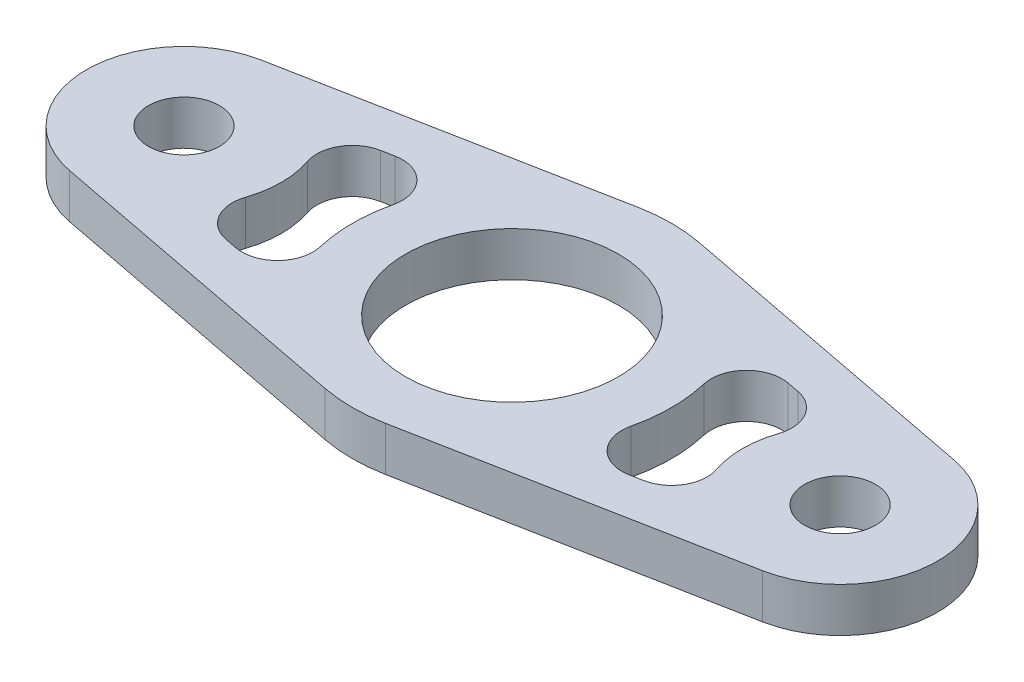
ISO-10303-21;
HEADER;
FILE_DESCRIPTION(('STEP AP214'),'2;1');
FILE_NAME('part.step','',(''),(''),'','','');
FILE_SCHEMA(('AUTOMOTIVE_DESIGN { 1 0 10303 214 1 1 1 1 }'));
ENDSEC;
DATA;
#1=APPLICATION_CONTEXT('core data for automotive mechanical design processes');
#2=APPLICATION_PROTOCOL_DEFINITION('international standard','automotive_design',2000,#1);
#3=PRODUCT_CONTEXT('',#1,'mechanical');
#4=PRODUCT('Part','Part','',(#3));
#5=PRODUCT_RELATED_PRODUCT_CATEGORY('part','',(#4));
#6=PRODUCT_DEFINITION_FORMATION('','',#4);
#7=PRODUCT_DEFINITION_CONTEXT('part definition',#1,'design');
#8=PRODUCT_DEFINITION('design','',#6,#7);
#9=PRODUCT_DEFINITION_SHAPE('','',#8);
#10=(LENGTH_UNIT() NAMED_UNIT(*) SI_UNIT(.MILLI.,.METRE.));
#11=(NAMED_UNIT(*) PLANE_ANGLE_UNIT() SI_UNIT($,.RADIAN.));
#12=(NAMED_UNIT(*) SI_UNIT($,.STERADIAN.) SOLID_ANGLE_UNIT());
#13=UNCERTAINTY_MEASURE_WITH_UNIT(LENGTH_MEASURE(1.E-05),#10,'distance_accuracy_value','');
#14=(GEOMETRIC_REPRESENTATION_CONTEXT(3) GLOBAL_UNCERTAINTY_ASSIGNED_CONTEXT((#13)) GLOBAL_UNIT_ASSIGNED_CONTEXT((#10,
#11,#12)) REPRESENTATION_CONTEXT('',''));
#15=CARTESIAN_POINT('',(0.,0.,0.));
#16=DIRECTION('',(0.,0.,1.));
#17=DIRECTION('',(1.,0.,0.));
#18=AXIS2_PLACEMENT_3D('',#15,#16,#17);
#19=CARTESIAN_POINT('',(3.4054054054054,2.5,-17.6749317968935));
#20=DIRECTION('',(-0.189189189189189,0.,0.98194065538297));
#21=DIRECTION('',(0.98194065538297,0.,0.189189189189189));
#22=AXIS2_PLACEMENT_3D('',#19,#20,#21);
#23=PLANE('',#22);
#24=DIRECTION('',(-0.98194065538297,0.,-0.189189189189189));
#25=VECTOR('',#24,1.);
#26=CARTESIAN_POINT('',(3.4054054054054,-2.5,-17.6749317968935));
#27=LINE('',#26,#25);
#28=CARTESIAN_POINT('',(39.0810810810811,-2.5,-10.8013472092127));
#29=VERTEX_POINT('',#28);
#30=CARTESIAN_POINT('',(3.40540540540541,-2.5,-17.6749317968935));
#31=VERTEX_POINT('',#30);
#32=EDGE_CURVE('E234',#29,#31,#27,.T.);
#33=ORIENTED_EDGE('',*,*,#32,.T.);
#34=DIRECTION('',(0.,-1.,0.));
#35=VECTOR('',#34,1.);
#36=CARTESIAN_POINT('',(3.40540540540541,2.5,-17.6749317968935));
#37=LINE('',#36,#35);
#38=CARTESIAN_POINT('',(3.40540540540541,2.5,-17.6749317968935));
#39=VERTEX_POINT('',#38);
#40=EDGE_CURVE('E213',#39,#31,#37,.T.);
#41=ORIENTED_EDGE('',*,*,#40,.F.);
#42=DIRECTION('',(-0.98194065538297,0.,-0.189189189189189));
#43=VECTOR('',#42,1.);
#44=CARTESIAN_POINT('',(3.4054054054054,2.5,-17.6749317968935));
#45=LINE('',#44,#43);
#46=CARTESIAN_POINT('',(39.0810810810811,2.5,-10.8013472092127));
#47=VERTEX_POINT('',#46);
#48=EDGE_CURVE('E221',#47,#39,#45,.T.);
#49=ORIENTED_EDGE('',*,*,#48,.F.);
#50=DIRECTION('',(0.,-1.,0.));
#51=VECTOR('',#50,1.);
#52=CARTESIAN_POINT('',(39.0810810810811,2.5,-10.8013472092127));
#53=LINE('',#52,#51);
#54=EDGE_CURVE('E404',#47,#29,#53,.T.);
#55=ORIENTED_EDGE('',*,*,#54,.T.);
#56=EDGE_LOOP('',(#33,#41,#49,#55));
#57=FACE_BOUND('',#56,.T.);
#58=ADVANCED_FACE('F45',(#57),#23,.F.);
#59=CARTESIAN_POINT('',(0.,2.5,0.));
#60=DIRECTION('',(0.,-1.,0.));
#61=DIRECTION('',(0.,0.,-1.));
#62=AXIS2_PLACEMENT_3D('',#59,#60,#61);
#63=CYLINDRICAL_SURFACE('',#62,18.);
#64=CARTESIAN_POINT('',(0.,-2.5,0.));
#65=DIRECTION('',(0.,1.,0.));
#66=DIRECTION('',(0.,0.,1.));
#67=AXIS2_PLACEMENT_3D('',#64,#65,#66);
#68=CIRCLE('',#67,18.);
#69=CARTESIAN_POINT('',(-3.40540540540541,-2.5,-17.6749317968935));
#70=VERTEX_POINT('',#69);
#71=EDGE_CURVE('E444',#31,#70,#68,.T.);
#72=ORIENTED_EDGE('',*,*,#71,.T.);
#73=DIRECTION('',(0.,-1.,0.));
#74=VECTOR('',#73,1.);
#75=CARTESIAN_POINT('',(-3.40540540540541,2.5,-17.6749317968935));
#76=LINE('',#75,#74);
#77=CARTESIAN_POINT('',(-3.40540540540541,2.5,-17.6749317968935));
#78=VERTEX_POINT('',#77);
#79=EDGE_CURVE('E215',#78,#70,#76,.T.);
#80=ORIENTED_EDGE('',*,*,#79,.F.);
#81=CARTESIAN_POINT('',(0.,2.5,0.));
#82=DIRECTION('',(0.,1.,0.));
#83=DIRECTION('',(0.,0.,1.));
#84=AXIS2_PLACEMENT_3D('',#81,#82,#83);
#85=CIRCLE('',#84,18.);
#86=EDGE_CURVE('E208',#39,#78,#85,.T.);
#87=ORIENTED_EDGE('',*,*,#86,.F.);
#88=ORIENTED_EDGE('',*,*,#40,.T.);
#89=EDGE_LOOP('',(#72,#80,#87,#88));
#90=FACE_BOUND('',#89,.T.);
#91=ADVANCED_FACE('F211',(#90),#63,.T.);
#92=CARTESIAN_POINT('',(-3.4054054054054,2.5,-17.6749317968935));
#93=DIRECTION('',(-0.189189189189189,0.,-0.98194065538297));
#94=DIRECTION('',(-0.98194065538297,0.,0.189189189189189));
#95=AXIS2_PLACEMENT_3D('',#92,#93,#94);
#96=PLANE('',#95);
#97=DIRECTION('',(0.98194065538297,0.,-0.189189189189189));
#98=VECTOR('',#97,1.);
#99=CARTESIAN_POINT('',(-3.4054054054054,-2.5,-17.6749317968935));
#100=LINE('',#99,#98);
#101=CARTESIAN_POINT('',(-39.0810810810811,-2.5,-10.8013472092127));
#102=VERTEX_POINT('',#101);
#103=EDGE_CURVE('E447',#102,#70,#100,.T.);
#104=ORIENTED_EDGE('',*,*,#103,.F.);
#105=DIRECTION('',(0.,-1.,0.));
#106=VECTOR('',#105,1.);
#107=CARTESIAN_POINT('',(-39.0810810810811,2.5,-10.8013472092127));
#108=LINE('',#107,#106);
#109=CARTESIAN_POINT('',(-39.0810810810811,2.5,-10.8013472092127));
#110=VERTEX_POINT('',#109);
#111=EDGE_CURVE('E242',#110,#102,#108,.T.);
#112=ORIENTED_EDGE('',*,*,#111,.F.);
#113=DIRECTION('',(0.98194065538297,0.,-0.189189189189189));
#114=VECTOR('',#113,1.);
#115=CARTESIAN_POINT('',(-3.4054054054054,2.5,-17.6749317968935));
#116=LINE('',#115,#114);
#117=EDGE_CURVE('E220',#110,#78,#116,.T.);
#118=ORIENTED_EDGE('',*,*,#117,.T.);
#119=ORIENTED_EDGE('',*,*,#79,.T.);
#120=EDGE_LOOP('',(#104,#112,#118,#119));
#121=FACE_BOUND('',#120,.T.);
#122=ADVANCED_FACE('F496',(#121),#96,.T.);
#123=CARTESIAN_POINT('',(-37.,2.5,0.));
#124=DIRECTION('',(0.,-1.,0.));
#125=DIRECTION('',(0.,0.,-1.));
#126=AXIS2_PLACEMENT_3D('',#123,#124,#125);
#127=CYLINDRICAL_SURFACE('',#126,11.);
#128=CARTESIAN_POINT('',(-37.,-2.5,0.));
#129=DIRECTION('',(0.,1.,0.));
#130=DIRECTION('',(0.,0.,1.));
#131=AXIS2_PLACEMENT_3D('',#128,#129,#130);
#132=CIRCLE('',#131,11.);
#133=CARTESIAN_POINT('',(-39.0810810810811,-2.5,10.8013472092127));
#134=VERTEX_POINT('',#133);
#135=EDGE_CURVE('E451',#102,#134,#132,.T.);
#136=ORIENTED_EDGE('',*,*,#135,.T.);
#137=DIRECTION('',(0.,-1.,0.));
#138=VECTOR('',#137,1.);
#139=CARTESIAN_POINT('',(-39.0810810810811,2.5,10.8013472092127));
#140=LINE('',#139,#138);
#141=CARTESIAN_POINT('',(-39.0810810810811,2.5,10.8013472092127));
#142=VERTEX_POINT('',#141);
#143=EDGE_CURVE('E482',#142,#134,#140,.T.);
#144=ORIENTED_EDGE('',*,*,#143,.F.);
#145=CARTESIAN_POINT('',(-37.,2.5,0.));
#146=DIRECTION('',(0.,1.,0.));
#147=DIRECTION('',(0.,0.,1.));
#148=AXIS2_PLACEMENT_3D('',#145,#146,#147);
#149=CIRCLE('',#148,11.);
#150=EDGE_CURVE('E389',#110,#142,#149,.T.);
#151=ORIENTED_EDGE('',*,*,#150,.F.);
#152=ORIENTED_EDGE('',*,*,#111,.T.);
#153=EDGE_LOOP('',(#136,#144,#151,#152));
#154=FACE_BOUND('',#153,.T.);
#155=ADVANCED_FACE('F489',(#154),#127,.T.);
#156=CARTESIAN_POINT('',(-3.4054054054054,2.5,17.6749317968935));
#157=DIRECTION('',(0.189189189189189,0.,-0.98194065538297));
#158=DIRECTION('',(-0.98194065538297,0.,-0.189189189189189));
#159=AXIS2_PLACEMENT_3D('',#156,#157,#158);
#160=PLANE('',#159);
#161=DIRECTION('',(0.98194065538297,0.,0.189189189189189));
#162=VECTOR('',#161,1.);
#163=CARTESIAN_POINT('',(-3.4054054054054,-2.5,17.6749317968935));
#164=LINE('',#163,#162);
#165=CARTESIAN_POINT('',(-3.40540540540541,-2.5,17.6749317968935));
#166=VERTEX_POINT('',#165);
#167=EDGE_CURVE('E454',#134,#166,#164,.T.);
#168=ORIENTED_EDGE('',*,*,#167,.T.);
#169=DIRECTION('',(0.,-1.,0.));
#170=VECTOR('',#169,1.);
#171=CARTESIAN_POINT('',(-3.40540540540541,2.5,17.6749317968935));
#172=LINE('',#171,#170);
#173=CARTESIAN_POINT('',(-3.40540540540541,2.5,17.6749317968935));
#174=VERTEX_POINT('',#173);
#175=EDGE_CURVE('E478',#174,#166,#172,.T.);
#176=ORIENTED_EDGE('',*,*,#175,.F.);
#177=DIRECTION('',(0.98194065538297,0.,0.189189189189189));
#178=VECTOR('',#177,1.);
#179=CARTESIAN_POINT('',(-3.4054054054054,2.5,17.6749317968935));
#180=LINE('',#179,#178);
#181=EDGE_CURVE('E392',#142,#174,#180,.T.);
#182=ORIENTED_EDGE('',*,*,#181,.F.);
#183=ORIENTED_EDGE('',*,*,#143,.T.);
#184=EDGE_LOOP('',(#168,#176,#182,#183));
#185=FACE_BOUND('',#184,.T.);
#186=ADVANCED_FACE('F510',(#185),#160,.F.);
#187=CARTESIAN_POINT('',(0.,2.5,0.));
#188=DIRECTION('',(0.,-1.,0.));
#189=DIRECTION('',(0.,0.,-1.));
#190=AXIS2_PLACEMENT_3D('',#187,#188,#189);
#191=CYLINDRICAL_SURFACE('',#190,18.);
#192=CARTESIAN_POINT('',(0.,-2.5,0.));
#193=DIRECTION('',(0.,1.,0.));
#194=DIRECTION('',(0.,0.,1.));
#195=AXIS2_PLACEMENT_3D('',#192,#193,#194);
#196=CIRCLE('',#195,18.);
#197=CARTESIAN_POINT('',(3.40540540540541,-2.5,17.6749317968935));
#198=VERTEX_POINT('',#197);
#199=EDGE_CURVE('E457',#166,#198,#196,.T.);
#200=ORIENTED_EDGE('',*,*,#199,.T.);
#201=DIRECTION('',(0.,-1.,0.));
#202=VECTOR('',#201,1.);
#203=CARTESIAN_POINT('',(3.40540540540541,2.5,17.6749317968935));
#204=LINE('',#203,#202);
#205=CARTESIAN_POINT('',(3.40540540540541,2.5,17.6749317968935));
#206=VERTEX_POINT('',#205);
#207=EDGE_CURVE('E475',#206,#198,#204,.T.);
#208=ORIENTED_EDGE('',*,*,#207,.F.);
#209=CARTESIAN_POINT('',(0.,2.5,0.));
#210=DIRECTION('',(0.,1.,0.));
#211=DIRECTION('',(0.,0.,1.));
#212=AXIS2_PLACEMENT_3D('',#209,#210,#211);
#213=CIRCLE('',#212,18.);
#214=EDGE_CURVE('E395',#174,#206,#213,.T.);
#215=ORIENTED_EDGE('',*,*,#214,.F.);
#216=ORIENTED_EDGE('',*,*,#175,.T.);
#217=EDGE_LOOP('',(#200,#208,#215,#216));
#218=FACE_BOUND('',#217,.T.);
#219=ADVANCED_FACE('F505',(#218),#191,.T.);
#220=CARTESIAN_POINT('',(3.4054054054054,2.5,17.6749317968935));
#221=DIRECTION('',(0.189189189189189,0.,0.98194065538297));
#222=DIRECTION('',(0.98194065538297,0.,-0.189189189189189));
#223=AXIS2_PLACEMENT_3D('',#220,#221,#222);
#224=PLANE('',#223);
#225=DIRECTION('',(-0.98194065538297,0.,0.189189189189189));
#226=VECTOR('',#225,1.);
#227=CARTESIAN_POINT('',(3.4054054054054,-2.5,17.6749317968935));
#228=LINE('',#227,#226);
#229=CARTESIAN_POINT('',(39.0810810810811,-2.5,10.8013472092127));
#230=VERTEX_POINT('',#229);
#231=EDGE_CURVE('E461',#230,#198,#228,.T.);
#232=ORIENTED_EDGE('',*,*,#231,.F.);
#233=DIRECTION('',(0.,-1.,0.));
#234=VECTOR('',#233,1.);
#235=CARTESIAN_POINT('',(39.0810810810811,2.5,10.8013472092127));
#236=LINE('',#235,#234);
#237=CARTESIAN_POINT('',(39.0810810810811,2.5,10.8013472092127));
#238=VERTEX_POINT('',#237);
#239=EDGE_CURVE('E472',#238,#230,#236,.T.);
#240=ORIENTED_EDGE('',*,*,#239,.F.);
#241=DIRECTION('',(-0.98194065538297,0.,0.189189189189189));
#242=VECTOR('',#241,1.);
#243=CARTESIAN_POINT('',(3.4054054054054,2.5,17.6749317968935));
#244=LINE('',#243,#242);
#245=EDGE_CURVE('E398',#238,#206,#244,.T.);
#246=ORIENTED_EDGE('',*,*,#245,.T.);
#247=ORIENTED_EDGE('',*,*,#207,.T.);
#248=EDGE_LOOP('',(#232,#240,#246,#247));
#249=FACE_BOUND('',#248,.T.);
#250=ADVANCED_FACE('F502',(#249),#224,.T.);
#251=CARTESIAN_POINT('',(37.,2.5,0.));
#252=DIRECTION('',(0.,-1.,0.));
#253=DIRECTION('',(0.,0.,-1.));
#254=AXIS2_PLACEMENT_3D('',#251,#252,#253);
#255=CYLINDRICAL_SURFACE('',#254,11.);
#256=CARTESIAN_POINT('',(37.,-2.5,0.));
#257=DIRECTION('',(0.,1.,0.));
#258=DIRECTION('',(0.,0.,1.));
#259=AXIS2_PLACEMENT_3D('',#256,#257,#258);
#260=CIRCLE('',#259,11.);
#261=CARTESIAN_POINT('',(26.57257279909,-2.5,3.50267925590137));
#262=VERTEX_POINT('',#261);
#263=CARTESIAN_POINT('',(26.57257279909,-2.5,-3.50267925590137));
#264=VERTEX_POINT('',#263);
#265=EDGE_CURVE('E426',#262,#264,#260,.F.);
#266=ORIENTED_EDGE('',*,*,#265,.F.);
#267=DIRECTION('',(0.,-1.,0.));
#268=VECTOR('',#267,1.);
#269=CARTESIAN_POINT('',(26.57257279909,2.5,3.50267925590137));
#270=LINE('',#269,#268);
#271=CARTESIAN_POINT('',(26.57257279909,2.5,3.50267925590137));
#272=VERTEX_POINT('',#271);
#273=EDGE_CURVE('E253',#262,#272,#270,.F.);
#274=ORIENTED_EDGE('',*,*,#273,.T.);
#275=CARTESIAN_POINT('',(37.,2.5,0.));
#276=DIRECTION('',(0.,1.,0.));
#277=DIRECTION('',(0.,0.,1.));
#278=AXIS2_PLACEMENT_3D('',#275,#276,#277);
#279=CIRCLE('',#278,11.);
#280=CARTESIAN_POINT('',(26.57257279909,2.5,-3.50267925590137));
#281=VERTEX_POINT('',#280);
#282=EDGE_CURVE('E366',#272,#281,#279,.F.);
#283=ORIENTED_EDGE('',*,*,#282,.T.);
#284=DIRECTION('',(0.,-1.,0.));
#285=VECTOR('',#284,1.);
#286=CARTESIAN_POINT('',(26.57257279909,2.5,-3.50267925590137));
#287=LINE('',#286,#285);
#288=EDGE_CURVE('E249',#281,#264,#287,.T.);
#289=ORIENTED_EDGE('',*,*,#288,.T.);
#290=EDGE_LOOP('',(#266,#274,#283,#289));
#291=FACE_BOUND('',#290,.T.);
#292=ADVANCED_FACE('F539',(#291),#255,.T.);
#293=CARTESIAN_POINT('',(2.45945945945946,2.5,12.7652285199786));
#294=DIRECTION('',(0.189189189189189,0.,0.98194065538297));
#295=DIRECTION('',(0.98194065538297,0.,-0.189189189189189));
#296=AXIS2_PLACEMENT_3D('',#293,#294,#295);
#297=PLANE('',#296);
#298=DIRECTION('',(-0.98194065538297,0.,0.189189189189189));
#299=VECTOR('',#298,1.);
#300=CARTESIAN_POINT('',(2.45945945945946,2.5,12.7652285199786));
#301=LINE('',#300,#299);
#302=CARTESIAN_POINT('',(23.5375378464249,2.5,8.70414342503375));
#303=VERTEX_POINT('',#302);
#304=CARTESIAN_POINT('',(22.1717805462736,2.5,8.96728205243285));
#305=VERTEX_POINT('',#304);
#306=EDGE_CURVE('E371',#303,#305,#301,.T.);
#307=ORIENTED_EDGE('',*,*,#306,.F.);
#308=DIRECTION('',(0.,-1.,0.));
#309=VECTOR('',#308,1.);
#310=CARTESIAN_POINT('',(23.5375378464249,2.5,8.70414342503375));
#311=LINE('',#310,#309);
#312=CARTESIAN_POINT('',(23.5375378464249,-2.5,8.70414342503375));
#313=VERTEX_POINT('',#312);
#314=EDGE_CURVE('E240',#303,#313,#311,.T.);
#315=ORIENTED_EDGE('',*,*,#314,.T.);
#316=DIRECTION('',(-0.98194065538297,0.,0.189189189189189));
#317=VECTOR('',#316,1.);
#318=CARTESIAN_POINT('',(2.45945945945946,-2.5,12.7652285199786));
#319=LINE('',#318,#317);
#320=CARTESIAN_POINT('',(22.1717805462736,-2.5,8.96728205243285));
#321=VERTEX_POINT('',#320);
#322=EDGE_CURVE('E430',#313,#321,#319,.T.);
#323=ORIENTED_EDGE('',*,*,#322,.T.);
#324=DIRECTION('',(0.,-1.,0.));
#325=VECTOR('',#324,1.);
#326=CARTESIAN_POINT('',(22.1717805462736,2.5,8.96728205243285));
#327=LINE('',#326,#325);
#328=EDGE_CURVE('E236',#321,#305,#327,.F.);
#329=ORIENTED_EDGE('',*,*,#328,.T.);
#330=EDGE_LOOP('',(#307,#315,#323,#329));
#331=FACE_BOUND('',#330,.T.);
#332=ADVANCED_FACE('F535',(#331),#297,.F.);
#333=CARTESIAN_POINT('',(0.,2.5,0.));
#334=DIRECTION('',(0.,-1.,0.));
#335=DIRECTION('',(0.,0.,-1.));
#336=AXIS2_PLACEMENT_3D('',#333,#334,#335);
#337=CYLINDRICAL_SURFACE('',#336,18.);
#338=CARTESIAN_POINT('',(0.,2.5,0.));
#339=DIRECTION('',(0.,1.,0.));
#340=DIRECTION('',(0.,0.,1.));
#341=AXIS2_PLACEMENT_3D('',#338,#339,#340);
#342=CIRCLE('',#341,18.);
#343=CARTESIAN_POINT('',(17.5213831005138,2.5,-4.12324317073716));
#344=VERTEX_POINT('',#343);
#345=CARTESIAN_POINT('',(17.5213831005138,2.5,4.12324317073716));
#346=VERTEX_POINT('',#345);
#347=EDGE_CURVE('E380',#344,#346,#342,.F.);
#348=ORIENTED_EDGE('',*,*,#347,.T.);
#349=DIRECTION('',(0.,-1.,0.));
#350=VECTOR('',#349,1.);
#351=CARTESIAN_POINT('',(17.5213831005138,2.5,4.12324317073716));
#352=LINE('',#351,#350);
#353=CARTESIAN_POINT('',(17.5213831005138,-2.5,4.12324317073716));
#354=VERTEX_POINT('',#353);
#355=EDGE_CURVE('E259',#346,#354,#352,.T.);
#356=ORIENTED_EDGE('',*,*,#355,.T.);
#357=CARTESIAN_POINT('',(0.,-2.5,0.));
#358=DIRECTION('',(0.,1.,0.));
#359=DIRECTION('',(0.,0.,1.));
#360=AXIS2_PLACEMENT_3D('',#357,#358,#359);
#361=CIRCLE('',#360,18.);
#362=CARTESIAN_POINT('',(17.5213831005138,-2.5,-4.12324317073716));
#363=VERTEX_POINT('',#362);
#364=EDGE_CURVE('E434',#363,#354,#361,.F.);
#365=ORIENTED_EDGE('',*,*,#364,.F.);
#366=DIRECTION('',(0.,-1.,0.));
#367=VECTOR('',#366,1.);
#368=CARTESIAN_POINT('',(17.5213831005138,2.5,-4.12324317073716));
#369=LINE('',#368,#367);
#370=EDGE_CURVE('E256',#363,#344,#369,.F.);
#371=ORIENTED_EDGE('',*,*,#370,.T.);
#372=EDGE_LOOP('',(#348,#356,#365,#371));
#373=FACE_BOUND('',#372,.T.);
#374=ADVANCED_FACE('F531',(#373),#337,.T.);
#375=CARTESIAN_POINT('',(-2.45945945945946,2.5,12.7652285199786));
#376=DIRECTION('',(0.189189189189189,0.,-0.98194065538297));
#377=DIRECTION('',(-0.98194065538297,0.,-0.189189189189189));
#378=AXIS2_PLACEMENT_3D('',#375,#376,#377);
#379=PLANE('',#378);
#380=DIRECTION('',(0.98194065538297,0.,0.189189189189189));
#381=VECTOR('',#380,1.);
#382=CARTESIAN_POINT('',(-2.45945945945946,2.5,12.7652285199786));
#383=LINE('',#382,#381);
#384=CARTESIAN_POINT('',(-23.5375378464249,2.5,8.70414342503375));
#385=VERTEX_POINT('',#384);
#386=CARTESIAN_POINT('',(-22.1717805462736,2.5,8.96728205243285));
#387=VERTEX_POINT('',#386);
#388=EDGE_CURVE('E604',#385,#387,#383,.T.);
#389=ORIENTED_EDGE('',*,*,#388,.T.);
#390=DIRECTION('',(0.,-1.,0.));
#391=VECTOR('',#390,1.);
#392=CARTESIAN_POINT('',(-22.1717805462736,2.5,8.96728205243285));
#393=LINE('',#392,#391);
#394=CARTESIAN_POINT('',(-22.1717805462736,-2.5,8.96728205243285));
#395=VERTEX_POINT('',#394);
#396=EDGE_CURVE('E273',#387,#395,#393,.T.);
#397=ORIENTED_EDGE('',*,*,#396,.T.);
#398=DIRECTION('',(0.98194065538297,0.,0.189189189189189));
#399=VECTOR('',#398,1.);
#400=CARTESIAN_POINT('',(-2.45945945945946,-2.5,12.7652285199786));
#401=LINE('',#400,#399);
#402=CARTESIAN_POINT('',(-23.5375378464249,-2.5,8.70414342503375));
#403=VERTEX_POINT('',#402);
#404=EDGE_CURVE('E417',#403,#395,#401,.T.);
#405=ORIENTED_EDGE('',*,*,#404,.F.);
#406=DIRECTION('',(0.,-1.,0.));
#407=VECTOR('',#406,1.);
#408=CARTESIAN_POINT('',(-23.5375378464249,2.5,8.70414342503375));
#409=LINE('',#408,#407);
#410=EDGE_CURVE('E270',#403,#385,#409,.F.);
#411=ORIENTED_EDGE('',*,*,#410,.T.);
#412=EDGE_LOOP('',(#389,#397,#405,#411));
#413=FACE_BOUND('',#412,.T.);
#414=ADVANCED_FACE('F534',(#413),#379,.T.);
#415=CARTESIAN_POINT('',(-37.,2.5,0.));
#416=DIRECTION('',(0.,-1.,0.));
#417=DIRECTION('',(0.,0.,-1.));
#418=AXIS2_PLACEMENT_3D('',#415,#416,#417);
#419=CYLINDRICAL_SURFACE('',#418,11.);
#420=CARTESIAN_POINT('',(-37.,2.5,0.));
#421=DIRECTION('',(0.,1.,0.));
#422=DIRECTION('',(0.,0.,1.));
#423=AXIS2_PLACEMENT_3D('',#420,#421,#422);
#424=CIRCLE('',#423,11.);
#425=CARTESIAN_POINT('',(-26.57257279909,2.5,3.50267925590137));
#426=VERTEX_POINT('',#425);
#427=CARTESIAN_POINT('',(-26.57257279909,2.5,-3.50267925590137));
#428=VERTEX_POINT('',#427);
#429=EDGE_CURVE('E373',#426,#428,#424,.T.);
#430=ORIENTED_EDGE('',*,*,#429,.F.);
#431=DIRECTION('',(0.,-1.,0.));
#432=VECTOR('',#431,1.);
#433=CARTESIAN_POINT('',(-26.57257279909,2.5,3.50267925590137));
#434=LINE('',#433,#432);
#435=CARTESIAN_POINT('',(-26.57257279909,-2.5,3.50267925590137));
#436=VERTEX_POINT('',#435);
#437=EDGE_CURVE('E287',#426,#436,#434,.T.);
#438=ORIENTED_EDGE('',*,*,#437,.T.);
#439=CARTESIAN_POINT('',(-37.,-2.5,0.));
#440=DIRECTION('',(0.,1.,0.));
#441=DIRECTION('',(0.,0.,1.));
#442=AXIS2_PLACEMENT_3D('',#439,#440,#441);
#443=CIRCLE('',#442,11.);
#444=CARTESIAN_POINT('',(-26.57257279909,-2.5,-3.50267925590137));
#445=VERTEX_POINT('',#444);
#446=EDGE_CURVE('E352',#436,#445,#443,.T.);
#447=ORIENTED_EDGE('',*,*,#446,.T.);
#448=DIRECTION('',(0.,-1.,0.));
#449=VECTOR('',#448,1.);
#450=CARTESIAN_POINT('',(-26.57257279909,2.5,-3.50267925590137));
#451=LINE('',#450,#449);
#452=EDGE_CURVE('E284',#445,#428,#451,.F.);
#453=ORIENTED_EDGE('',*,*,#452,.T.);
#454=EDGE_LOOP('',(#430,#438,#447,#453));
#455=FACE_BOUND('',#454,.T.);
#456=ADVANCED_FACE('F549',(#455),#419,.T.);
#457=CARTESIAN_POINT('',(-2.45945945945946,2.5,-12.7652285199786));
#458=DIRECTION('',(-0.189189189189189,0.,-0.98194065538297));
#459=DIRECTION('',(-0.98194065538297,0.,0.189189189189189));
#460=AXIS2_PLACEMENT_3D('',#457,#458,#459);
#461=PLANE('',#460);
#462=DIRECTION('',(0.98194065538297,0.,-0.189189189189189));
#463=VECTOR('',#462,1.);
#464=CARTESIAN_POINT('',(-2.45945945945946,2.5,-12.7652285199786));
#465=LINE('',#464,#463);
#466=CARTESIAN_POINT('',(-23.5375378464249,2.5,-8.70414342503375));
#467=VERTEX_POINT('',#466);
#468=CARTESIAN_POINT('',(-22.1717805462736,2.5,-8.96728205243285));
#469=VERTEX_POINT('',#468);
#470=EDGE_CURVE('E361',#467,#469,#465,.T.);
#471=ORIENTED_EDGE('',*,*,#470,.F.);
#472=DIRECTION('',(0.,1.,0.));
#473=VECTOR('',#472,1.);
#474=CARTESIAN_POINT('',(-23.5375378464249,-2.5,-8.70414342503375));
#475=LINE('',#474,#473);
#476=CARTESIAN_POINT('',(-23.5375378464249,-2.5,-8.70414342503375));
#477=VERTEX_POINT('',#476);
#478=EDGE_CURVE('E293',#467,#477,#475,.F.);
#479=ORIENTED_EDGE('',*,*,#478,.T.);
#480=DIRECTION('',(0.98194065538297,0.,-0.189189189189189));
#481=VECTOR('',#480,1.);
#482=CARTESIAN_POINT('',(-2.45945945945946,-2.5,-12.7652285199786));
#483=LINE('',#482,#481);
#484=CARTESIAN_POINT('',(-22.1717805462736,-2.5,-8.96728205243285));
#485=VERTEX_POINT('',#484);
#486=EDGE_CURVE('E344',#477,#485,#483,.T.);
#487=ORIENTED_EDGE('',*,*,#486,.T.);
#488=DIRECTION('',(0.,1.,0.));
#489=VECTOR('',#488,1.);
#490=CARTESIAN_POINT('',(-22.1717805462736,2.5,-8.96728205243285));
#491=LINE('',#490,#489);
#492=EDGE_CURVE('E61',#485,#469,#491,.T.);
#493=ORIENTED_EDGE('',*,*,#492,.T.);
#494=EDGE_LOOP('',(#471,#479,#487,#493));
#495=FACE_BOUND('',#494,.T.);
#496=ADVANCED_FACE('F349',(#495),#461,.F.);
#497=CARTESIAN_POINT('',(2.45945945945946,2.5,-12.7652285199786));
#498=DIRECTION('',(-0.189189189189189,0.,0.98194065538297));
#499=DIRECTION('',(0.98194065538297,0.,0.189189189189189));
#500=AXIS2_PLACEMENT_3D('',#497,#498,#499);
#501=PLANE('',#500);
#502=DIRECTION('',(-0.98194065538297,0.,-0.189189189189189));
#503=VECTOR('',#502,1.);
#504=CARTESIAN_POINT('',(2.45945945945946,-2.5,-12.7652285199786));
#505=LINE('',#504,#503);
#506=CARTESIAN_POINT('',(23.5375378464249,-2.5,-8.70414342503375));
#507=VERTEX_POINT('',#506);
#508=CARTESIAN_POINT('',(22.1717805462736,-2.5,-8.96728205243285));
#509=VERTEX_POINT('',#508);
#510=EDGE_CURVE('E438',#507,#509,#505,.T.);
#511=ORIENTED_EDGE('',*,*,#510,.F.);
#512=DIRECTION('',(0.,1.,0.));
#513=VECTOR('',#512,1.);
#514=CARTESIAN_POINT('',(23.5375378464249,2.5,-8.70414342503375));
#515=LINE('',#514,#513);
#516=CARTESIAN_POINT('',(23.5375378464249,2.5,-8.70414342503375));
#517=VERTEX_POINT('',#516);
#518=EDGE_CURVE('E267',#507,#517,#515,.T.);
#519=ORIENTED_EDGE('',*,*,#518,.T.);
#520=DIRECTION('',(-0.98194065538297,0.,-0.189189189189189));
#521=VECTOR('',#520,1.);
#522=CARTESIAN_POINT('',(2.45945945945946,2.5,-12.7652285199786));
#523=LINE('',#522,#521);
#524=CARTESIAN_POINT('',(22.1717805462736,2.5,-8.96728205243285));
#525=VERTEX_POINT('',#524);
#526=EDGE_CURVE('E231',#517,#525,#523,.T.);
#527=ORIENTED_EDGE('',*,*,#526,.T.);
#528=DIRECTION('',(0.,1.,0.));
#529=VECTOR('',#528,1.);
#530=CARTESIAN_POINT('',(22.1717805462736,-2.5,-8.96728205243285));
#531=LINE('',#530,#529);
#532=EDGE_CURVE('E263',#525,#509,#531,.F.);
#533=ORIENTED_EDGE('',*,*,#532,.T.);
#534=EDGE_LOOP('',(#511,#519,#527,#533));
#535=FACE_BOUND('',#534,.T.);
#536=ADVANCED_FACE('F527',(#535),#501,.T.);
#537=CARTESIAN_POINT('',(0.,2.5,0.));
#538=DIRECTION('',(0.,-1.,0.));
#539=DIRECTION('',(0.,0.,-1.));
#540=AXIS2_PLACEMENT_3D('',#537,#538,#539);
#541=CYLINDRICAL_SURFACE('',#540,18.);
#542=CARTESIAN_POINT('',(0.,-2.5,0.));
#543=DIRECTION('',(0.,1.,0.));
#544=DIRECTION('',(0.,0.,1.));
#545=AXIS2_PLACEMENT_3D('',#542,#543,#544);
#546=CIRCLE('',#545,18.);
#547=CARTESIAN_POINT('',(-17.5213831005138,-2.5,-4.12324317073716));
#548=VERTEX_POINT('',#547);
#549=CARTESIAN_POINT('',(-17.5213831005138,-2.5,4.12324317073716));
#550=VERTEX_POINT('',#549);
#551=EDGE_CURVE('E346',#548,#550,#546,.T.);
#552=ORIENTED_EDGE('',*,*,#551,.T.);
#553=DIRECTION('',(0.,-1.,0.));
#554=VECTOR('',#553,1.);
#555=CARTESIAN_POINT('',(-17.5213831005138,2.5,4.12324317073716));
#556=LINE('',#555,#554);
#557=CARTESIAN_POINT('',(-17.5213831005138,2.5,4.12324317073716));
#558=VERTEX_POINT('',#557);
#559=EDGE_CURVE('E281',#550,#558,#556,.F.);
#560=ORIENTED_EDGE('',*,*,#559,.T.);
#561=CARTESIAN_POINT('',(0.,2.5,0.));
#562=DIRECTION('',(0.,1.,0.));
#563=DIRECTION('',(0.,0.,1.));
#564=AXIS2_PLACEMENT_3D('',#561,#562,#563);
#565=CIRCLE('',#564,18.);
#566=CARTESIAN_POINT('',(-17.5213831005138,2.5,-4.12324317073716));
#567=VERTEX_POINT('',#566);
#568=EDGE_CURVE('E359',#567,#558,#565,.T.);
#569=ORIENTED_EDGE('',*,*,#568,.F.);
#570=DIRECTION('',(0.,-1.,0.));
#571=VECTOR('',#570,1.);
#572=CARTESIAN_POINT('',(-17.5213831005138,2.5,-4.12324317073716));
#573=LINE('',#572,#571);
#574=EDGE_CURVE('E277',#567,#548,#573,.T.);
#575=ORIENTED_EDGE('',*,*,#574,.T.);
#576=EDGE_LOOP('',(#552,#560,#569,#575));
#577=FACE_BOUND('',#576,.T.);
#578=ADVANCED_FACE('F363',(#577),#541,.T.);
#579=CARTESIAN_POINT('',(0.,2.5,0.));
#580=DIRECTION('',(0.,-1.,0.));
#581=DIRECTION('',(0.,0.,-1.));
#582=AXIS2_PLACEMENT_3D('',#579,#580,#581);
#583=CYLINDRICAL_SURFACE('',#582,12.);
#584=CARTESIAN_POINT('',(0.,2.5,0.));
#585=DIRECTION('',(0.,1.,0.));
#586=DIRECTION('',(0.,0.,1.));
#587=AXIS2_PLACEMENT_3D('',#584,#585,#586);
#588=CIRCLE('',#587,12.);
#589=CARTESIAN_POINT('',(0.,2.5,12.));
#590=VERTEX_POINT('',#589);
#591=EDGE_CURVE('E606',#590,#590,#588,.T.);
#592=ORIENTED_EDGE('',*,*,#591,.T.);
#593=EDGE_LOOP('',(#592));
#594=FACE_BOUND('',#593,.T.);
#595=CARTESIAN_POINT('',(0.,-2.5,0.));
#596=DIRECTION('',(0.,1.,0.));
#597=DIRECTION('',(0.,0.,1.));
#598=AXIS2_PLACEMENT_3D('',#595,#596,#597);
#599=CIRCLE('',#598,12.);
#600=CARTESIAN_POINT('',(0.,-2.5,12.));
#601=VERTEX_POINT('',#600);
#602=EDGE_CURVE('E413',#601,#601,#599,.T.);
#603=ORIENTED_EDGE('',*,*,#602,.F.);
#604=EDGE_LOOP('',(#603));
#605=FACE_BOUND('',#604,.T.);
#606=ADVANCED_FACE('F546',(#594,#605),#583,.F.);
#607=CARTESIAN_POINT('',(-37.,2.5,0.));
#608=DIRECTION('',(0.,-1.,0.));
#609=DIRECTION('',(0.,0.,-1.));
#610=AXIS2_PLACEMENT_3D('',#607,#608,#609);
#611=CYLINDRICAL_SURFACE('',#610,4.00000000000001);
#612=CARTESIAN_POINT('',(-37.,2.5,0.));
#613=DIRECTION('',(0.,1.,0.));
#614=DIRECTION('',(0.,0.,1.));
#615=AXIS2_PLACEMENT_3D('',#612,#613,#614);
#616=CIRCLE('',#615,4.00000000000001);
#617=CARTESIAN_POINT('',(-37.,2.5,4.00000000000001));
#618=VERTEX_POINT('',#617);
#619=EDGE_CURVE('E611',#618,#618,#616,.T.);
#620=ORIENTED_EDGE('',*,*,#619,.T.);
#621=EDGE_LOOP('',(#620));
#622=FACE_BOUND('',#621,.T.);
#623=CARTESIAN_POINT('',(-37.,-2.5,0.));
#624=DIRECTION('',(0.,1.,0.));
#625=DIRECTION('',(0.,0.,1.));
#626=AXIS2_PLACEMENT_3D('',#623,#624,#625);
#627=CIRCLE('',#626,4.00000000000001);
#628=CARTESIAN_POINT('',(-37.,-2.5,4.00000000000001));
#629=VERTEX_POINT('',#628);
#630=EDGE_CURVE('E409',#629,#629,#627,.T.);
#631=ORIENTED_EDGE('',*,*,#630,.F.);
#632=EDGE_LOOP('',(#631));
#633=FACE_BOUND('',#632,.T.);
#634=ADVANCED_FACE('F558',(#622,#633),#611,.F.);
#635=CARTESIAN_POINT('',(37.,2.5,0.));
#636=DIRECTION('',(0.,-1.,0.));
#637=DIRECTION('',(0.,0.,-1.));
#638=AXIS2_PLACEMENT_3D('',#635,#636,#637);
#639=CYLINDRICAL_SURFACE('',#638,4.00000000000001);
#640=CARTESIAN_POINT('',(37.,2.5,0.));
#641=DIRECTION('',(0.,1.,0.));
#642=DIRECTION('',(0.,0.,1.));
#643=AXIS2_PLACEMENT_3D('',#640,#641,#642);
#644=CIRCLE('',#643,4.00000000000001);
#645=CARTESIAN_POINT('',(37.,2.5,4.00000000000001));
#646=VERTEX_POINT('',#645);
#647=EDGE_CURVE('E469',#646,#646,#644,.F.);
#648=ORIENTED_EDGE('',*,*,#647,.F.);
#649=EDGE_LOOP('',(#648));
#650=FACE_BOUND('',#649,.T.);
#651=CARTESIAN_POINT('',(37.,-2.5,0.));
#652=DIRECTION('',(0.,1.,0.));
#653=DIRECTION('',(0.,0.,1.));
#654=AXIS2_PLACEMENT_3D('',#651,#652,#653);
#655=CIRCLE('',#654,4.00000000000001);
#656=CARTESIAN_POINT('',(37.,-2.5,4.00000000000001));
#657=VERTEX_POINT('',#656);
#658=EDGE_CURVE('E405',#657,#657,#655,.F.);
#659=ORIENTED_EDGE('',*,*,#658,.T.);
#660=EDGE_LOOP('',(#659));
#661=FACE_BOUND('',#660,.T.);
#662=ADVANCED_FACE('F562',(#650,#661),#639,.F.);
#663=CARTESIAN_POINT('',(37.,2.5,0.));
#664=DIRECTION('',(0.,-1.,0.));
#665=DIRECTION('',(0.,0.,-1.));
#666=AXIS2_PLACEMENT_3D('',#663,#664,#665);
#667=CYLINDRICAL_SURFACE('',#666,11.);
#668=CARTESIAN_POINT('',(37.,-2.5,0.));
#669=DIRECTION('',(0.,1.,0.));
#670=DIRECTION('',(0.,0.,1.));
#671=AXIS2_PLACEMENT_3D('',#668,#669,#670);
#672=CIRCLE('',#671,11.);
#673=EDGE_CURVE('E465',#29,#230,#672,.F.);
#674=ORIENTED_EDGE('',*,*,#673,.F.);
#675=ORIENTED_EDGE('',*,*,#54,.F.);
#676=CARTESIAN_POINT('',(37.,2.5,0.));
#677=DIRECTION('',(0.,1.,0.));
#678=DIRECTION('',(0.,0.,1.));
#679=AXIS2_PLACEMENT_3D('',#676,#677,#678);
#680=CIRCLE('',#679,11.);
#681=EDGE_CURVE('E228',#47,#238,#680,.F.);
#682=ORIENTED_EDGE('',*,*,#681,.T.);
#683=ORIENTED_EDGE('',*,*,#239,.T.);
#684=EDGE_LOOP('',(#674,#675,#682,#683));
#685=FACE_BOUND('',#684,.T.);
#686=ADVANCED_FACE('F499',(#685),#667,.T.);
#687=CARTESIAN_POINT('',(0.,2.5,0.));
#688=DIRECTION('',(0.,1.,0.));
#689=DIRECTION('',(0.,0.,1.));
#690=AXIS2_PLACEMENT_3D('',#687,#688,#689);
#691=PLANE('',#690);
#692=ORIENTED_EDGE('',*,*,#647,.T.);
#693=EDGE_LOOP('',(#692));
#694=FACE_BOUND('',#693,.T.);
#695=ORIENTED_EDGE('',*,*,#619,.F.);
#696=EDGE_LOOP('',(#695));
#697=FACE_BOUND('',#696,.T.);
#698=ORIENTED_EDGE('',*,*,#591,.F.);
#699=EDGE_LOOP('',(#698));
#700=FACE_BOUND('',#699,.T.);
#701=ORIENTED_EDGE('',*,*,#388,.F.);
#702=CARTESIAN_POINT('',(-22.7807810896681,2.5,4.77638080350187));
#703=DIRECTION('',(0.,1.,0.));
#704=DIRECTION('',(0.,0.,1.));
#705=AXIS2_PLACEMENT_3D('',#702,#703,#704);
#706=CIRCLE('',#705,4.);
#707=EDGE_CURVE('E330',#385,#426,#706,.F.);
#708=ORIENTED_EDGE('',*,*,#707,.T.);
#709=ORIENTED_EDGE('',*,*,#429,.T.);
#710=CARTESIAN_POINT('',(-22.7807810896681,2.5,-4.77638080350187));
#711=DIRECTION('',(0.,1.,0.));
#712=DIRECTION('',(0.,0.,1.));
#713=AXIS2_PLACEMENT_3D('',#710,#711,#712);
#714=CIRCLE('',#713,4.);
#715=EDGE_CURVE('E68',#428,#467,#714,.F.);
#716=ORIENTED_EDGE('',*,*,#715,.T.);
#717=ORIENTED_EDGE('',*,*,#470,.T.);
#718=CARTESIAN_POINT('',(-21.4150237895168,2.5,-5.03951943090097));
#719=DIRECTION('',(0.,1.,0.));
#720=DIRECTION('',(0.,0.,1.));
#721=AXIS2_PLACEMENT_3D('',#718,#719,#720);
#722=CIRCLE('',#721,4.);
#723=EDGE_CURVE('E11',#469,#567,#722,.F.);
#724=ORIENTED_EDGE('',*,*,#723,.T.);
#725=ORIENTED_EDGE('',*,*,#568,.T.);
#726=CARTESIAN_POINT('',(-21.4150237895168,2.5,5.03951943090097));
#727=DIRECTION('',(0.,1.,0.));
#728=DIRECTION('',(0.,0.,1.));
#729=AXIS2_PLACEMENT_3D('',#726,#727,#728);
#730=CIRCLE('',#729,4.);
#731=EDGE_CURVE('E324',#558,#387,#730,.F.);
#732=ORIENTED_EDGE('',*,*,#731,.T.);
#733=EDGE_LOOP('',(#701,#708,#709,#716,#717,#724,#725,#732));
#734=FACE_BOUND('',#733,.T.);
#735=ORIENTED_EDGE('',*,*,#282,.F.);
#736=CARTESIAN_POINT('',(22.7807810896681,2.5,4.77638080350187));
#737=DIRECTION('',(0.,1.,0.));
#738=DIRECTION('',(0.,0.,1.));
#739=AXIS2_PLACEMENT_3D('',#736,#737,#738);
#740=CIRCLE('',#739,4.);
#741=EDGE_CURVE('E300',#272,#303,#740,.F.);
#742=ORIENTED_EDGE('',*,*,#741,.T.);
#743=ORIENTED_EDGE('',*,*,#306,.T.);
#744=CARTESIAN_POINT('',(21.4150237895168,2.5,5.03951943090097));
#745=DIRECTION('',(0.,1.,0.));
#746=DIRECTION('',(0.,0.,1.));
#747=AXIS2_PLACEMENT_3D('',#744,#745,#746);
#748=CIRCLE('',#747,4.);
#749=EDGE_CURVE('E306',#305,#346,#748,.F.);
#750=ORIENTED_EDGE('',*,*,#749,.T.);
#751=ORIENTED_EDGE('',*,*,#347,.F.);
#752=CARTESIAN_POINT('',(21.4150237895168,2.5,-5.03951943090097));
#753=DIRECTION('',(0.,1.,0.));
#754=DIRECTION('',(0.,0.,1.));
#755=AXIS2_PLACEMENT_3D('',#752,#753,#754);
#756=CIRCLE('',#755,4.);
#757=EDGE_CURVE('E318',#344,#525,#756,.F.);
#758=ORIENTED_EDGE('',*,*,#757,.T.);
#759=ORIENTED_EDGE('',*,*,#526,.F.);
#760=CARTESIAN_POINT('',(22.7807810896681,2.5,-4.77638080350187));
#761=DIRECTION('',(0.,1.,0.));
#762=DIRECTION('',(0.,0.,1.));
#763=AXIS2_PLACEMENT_3D('',#760,#761,#762);
#764=CIRCLE('',#763,4.);
#765=EDGE_CURVE('E312',#517,#281,#764,.F.);
#766=ORIENTED_EDGE('',*,*,#765,.T.);
#767=EDGE_LOOP('',(#735,#742,#743,#750,#751,#758,#759,#766));
#768=FACE_BOUND('',#767,.T.);
#769=ORIENTED_EDGE('',*,*,#48,.T.);
#770=ORIENTED_EDGE('',*,*,#86,.T.);
#771=ORIENTED_EDGE('',*,*,#117,.F.);
#772=ORIENTED_EDGE('',*,*,#150,.T.);
#773=ORIENTED_EDGE('',*,*,#181,.T.);
#774=ORIENTED_EDGE('',*,*,#214,.T.);
#775=ORIENTED_EDGE('',*,*,#245,.F.);
#776=ORIENTED_EDGE('',*,*,#681,.F.);
#777=EDGE_LOOP('',(#769,#770,#771,#772,#773,#774,#775,#776));
#778=FACE_BOUND('',#777,.T.);
#779=ADVANCED_FACE('F225',(#694,#697,#700,#734,#768,#778),#691,.T.);
#780=CARTESIAN_POINT('',(0.,-2.5,0.));
#781=DIRECTION('',(0.,1.,0.));
#782=DIRECTION('',(0.,0.,1.));
#783=AXIS2_PLACEMENT_3D('',#780,#781,#782);
#784=PLANE('',#783);
#785=ORIENTED_EDGE('',*,*,#658,.F.);
#786=EDGE_LOOP('',(#785));
#787=FACE_BOUND('',#786,.T.);
#788=ORIENTED_EDGE('',*,*,#630,.T.);
#789=EDGE_LOOP('',(#788));
#790=FACE_BOUND('',#789,.T.);
#791=ORIENTED_EDGE('',*,*,#602,.T.);
#792=EDGE_LOOP('',(#791));
#793=FACE_BOUND('',#792,.T.);
#794=ORIENTED_EDGE('',*,*,#446,.F.);
#795=CARTESIAN_POINT('',(-22.7807810896681,-2.5,4.77638080350187));
#796=DIRECTION('',(0.,1.,0.));
#797=DIRECTION('',(0.,0.,1.));
#798=AXIS2_PLACEMENT_3D('',#795,#796,#797);
#799=CIRCLE('',#798,4.);
#800=EDGE_CURVE('E327',#436,#403,#799,.T.);
#801=ORIENTED_EDGE('',*,*,#800,.T.);
#802=ORIENTED_EDGE('',*,*,#404,.T.);
#803=CARTESIAN_POINT('',(-21.4150237895168,-2.5,5.03951943090097));
#804=DIRECTION('',(0.,1.,0.));
#805=DIRECTION('',(0.,0.,1.));
#806=AXIS2_PLACEMENT_3D('',#803,#804,#805);
#807=CIRCLE('',#806,4.);
#808=EDGE_CURVE('E321',#395,#550,#807,.T.);
#809=ORIENTED_EDGE('',*,*,#808,.T.);
#810=ORIENTED_EDGE('',*,*,#551,.F.);
#811=CARTESIAN_POINT('',(-21.4150237895168,-2.5,-5.03951943090097));
#812=DIRECTION('',(0.,1.,0.));
#813=DIRECTION('',(0.,0.,1.));
#814=AXIS2_PLACEMENT_3D('',#811,#812,#813);
#815=CIRCLE('',#814,4.);
#816=EDGE_CURVE('E54',#548,#485,#815,.T.);
#817=ORIENTED_EDGE('',*,*,#816,.T.);
#818=ORIENTED_EDGE('',*,*,#486,.F.);
#819=CARTESIAN_POINT('',(-22.7807810896681,-2.5,-4.77638080350187));
#820=DIRECTION('',(0.,1.,0.));
#821=DIRECTION('',(0.,0.,1.));
#822=AXIS2_PLACEMENT_3D('',#819,#820,#821);
#823=CIRCLE('',#822,4.);
#824=EDGE_CURVE('E333',#477,#445,#823,.T.);
#825=ORIENTED_EDGE('',*,*,#824,.T.);
#826=EDGE_LOOP('',(#794,#801,#802,#809,#810,#817,#818,#825));
#827=FACE_BOUND('',#826,.T.);
#828=ORIENTED_EDGE('',*,*,#322,.F.);
#829=CARTESIAN_POINT('',(22.7807810896681,-2.5,4.77638080350187));
#830=DIRECTION('',(0.,1.,0.));
#831=DIRECTION('',(0.,0.,1.));
#832=AXIS2_PLACEMENT_3D('',#829,#830,#831);
#833=CIRCLE('',#832,4.);
#834=EDGE_CURVE('E297',#313,#262,#833,.T.);
#835=ORIENTED_EDGE('',*,*,#834,.T.);
#836=ORIENTED_EDGE('',*,*,#265,.T.);
#837=CARTESIAN_POINT('',(22.7807810896681,-2.5,-4.77638080350187));
#838=DIRECTION('',(0.,1.,0.));
#839=DIRECTION('',(0.,0.,1.));
#840=AXIS2_PLACEMENT_3D('',#837,#838,#839);
#841=CIRCLE('',#840,4.);
#842=EDGE_CURVE('E309',#264,#507,#841,.T.);
#843=ORIENTED_EDGE('',*,*,#842,.T.);
#844=ORIENTED_EDGE('',*,*,#510,.T.);
#845=CARTESIAN_POINT('',(21.4150237895168,-2.5,-5.03951943090097));
#846=DIRECTION('',(0.,1.,0.));
#847=DIRECTION('',(0.,0.,1.));
#848=AXIS2_PLACEMENT_3D('',#845,#846,#847);
#849=CIRCLE('',#848,4.);
#850=EDGE_CURVE('E315',#509,#363,#849,.T.);
#851=ORIENTED_EDGE('',*,*,#850,.T.);
#852=ORIENTED_EDGE('',*,*,#364,.T.);
#853=CARTESIAN_POINT('',(21.4150237895168,-2.5,5.03951943090097));
#854=DIRECTION('',(0.,1.,0.));
#855=DIRECTION('',(0.,0.,1.));
#856=AXIS2_PLACEMENT_3D('',#853,#854,#855);
#857=CIRCLE('',#856,4.);
#858=EDGE_CURVE('E303',#354,#321,#857,.T.);
#859=ORIENTED_EDGE('',*,*,#858,.T.);
#860=EDGE_LOOP('',(#828,#835,#836,#843,#844,#851,#852,#859));
#861=FACE_BOUND('',#860,.T.);
#862=ORIENTED_EDGE('',*,*,#32,.F.);
#863=ORIENTED_EDGE('',*,*,#673,.T.);
#864=ORIENTED_EDGE('',*,*,#231,.T.);
#865=ORIENTED_EDGE('',*,*,#199,.F.);
#866=ORIENTED_EDGE('',*,*,#167,.F.);
#867=ORIENTED_EDGE('',*,*,#135,.F.);
#868=ORIENTED_EDGE('',*,*,#103,.T.);
#869=ORIENTED_EDGE('',*,*,#71,.F.);
#870=EDGE_LOOP('',(#862,#863,#864,#865,#866,#867,#868,#869));
#871=FACE_BOUND('',#870,.T.);
#872=ADVANCED_FACE('F342',(#787,#790,#793,#827,#861,#871),#784,.F.);
#873=CARTESIAN_POINT('',(22.7807810896681,2.5,4.77638080350187));
#874=DIRECTION('',(0.,-1.,0.));
#875=DIRECTION('',(0.,0.,-1.));
#876=AXIS2_PLACEMENT_3D('',#873,#874,#875);
#877=CYLINDRICAL_SURFACE('',#876,4.);
#878=ORIENTED_EDGE('',*,*,#741,.F.);
#879=ORIENTED_EDGE('',*,*,#273,.F.);
#880=ORIENTED_EDGE('',*,*,#834,.F.);
#881=ORIENTED_EDGE('',*,*,#314,.F.);
#882=EDGE_LOOP('',(#878,#879,#880,#881));
#883=FACE_BOUND('',#882,.T.);
#884=ADVANCED_FACE('F567',(#883),#877,.F.);
#885=CARTESIAN_POINT('',(21.4150237895168,2.5,5.03951943090097));
#886=DIRECTION('',(0.,-1.,0.));
#887=DIRECTION('',(0.,0.,-1.));
#888=AXIS2_PLACEMENT_3D('',#885,#886,#887);
#889=CYLINDRICAL_SURFACE('',#888,4.);
#890=ORIENTED_EDGE('',*,*,#749,.F.);
#891=ORIENTED_EDGE('',*,*,#328,.F.);
#892=ORIENTED_EDGE('',*,*,#858,.F.);
#893=ORIENTED_EDGE('',*,*,#355,.F.);
#894=EDGE_LOOP('',(#890,#891,#892,#893));
#895=FACE_BOUND('',#894,.T.);
#896=ADVANCED_FACE('F570',(#895),#889,.F.);
#897=CARTESIAN_POINT('',(22.7807810896681,2.5,-4.77638080350187));
#898=DIRECTION('',(0.,-1.,0.));
#899=DIRECTION('',(0.,0.,-1.));
#900=AXIS2_PLACEMENT_3D('',#897,#898,#899);
#901=CYLINDRICAL_SURFACE('',#900,4.);
#902=ORIENTED_EDGE('',*,*,#765,.F.);
#903=ORIENTED_EDGE('',*,*,#518,.F.);
#904=ORIENTED_EDGE('',*,*,#842,.F.);
#905=ORIENTED_EDGE('',*,*,#288,.F.);
#906=EDGE_LOOP('',(#902,#903,#904,#905));
#907=FACE_BOUND('',#906,.T.);
#908=ADVANCED_FACE('F574',(#907),#901,.F.);
#909=CARTESIAN_POINT('',(21.4150237895168,2.5,-5.03951943090097));
#910=DIRECTION('',(0.,-1.,0.));
#911=DIRECTION('',(0.,0.,-1.));
#912=AXIS2_PLACEMENT_3D('',#909,#910,#911);
#913=CYLINDRICAL_SURFACE('',#912,4.);
#914=ORIENTED_EDGE('',*,*,#757,.F.);
#915=ORIENTED_EDGE('',*,*,#370,.F.);
#916=ORIENTED_EDGE('',*,*,#850,.F.);
#917=ORIENTED_EDGE('',*,*,#532,.F.);
#918=EDGE_LOOP('',(#914,#915,#916,#917));
#919=FACE_BOUND('',#918,.T.);
#920=ADVANCED_FACE('F578',(#919),#913,.F.);
#921=CARTESIAN_POINT('',(-21.4150237895168,2.5,5.03951943090097));
#922=DIRECTION('',(0.,-1.,0.));
#923=DIRECTION('',(0.,0.,-1.));
#924=AXIS2_PLACEMENT_3D('',#921,#922,#923);
#925=CYLINDRICAL_SURFACE('',#924,4.);
#926=ORIENTED_EDGE('',*,*,#731,.F.);
#927=ORIENTED_EDGE('',*,*,#559,.F.);
#928=ORIENTED_EDGE('',*,*,#808,.F.);
#929=ORIENTED_EDGE('',*,*,#396,.F.);
#930=EDGE_LOOP('',(#926,#927,#928,#929));
#931=FACE_BOUND('',#930,.T.);
#932=ADVANCED_FACE('F582',(#931),#925,.F.);
#933=CARTESIAN_POINT('',(-22.7807810896681,2.5,4.77638080350187));
#934=DIRECTION('',(0.,-1.,0.));
#935=DIRECTION('',(0.,0.,-1.));
#936=AXIS2_PLACEMENT_3D('',#933,#934,#935);
#937=CYLINDRICAL_SURFACE('',#936,4.);
#938=ORIENTED_EDGE('',*,*,#707,.F.);
#939=ORIENTED_EDGE('',*,*,#410,.F.);
#940=ORIENTED_EDGE('',*,*,#800,.F.);
#941=ORIENTED_EDGE('',*,*,#437,.F.);
#942=EDGE_LOOP('',(#938,#939,#940,#941));
#943=FACE_BOUND('',#942,.T.);
#944=ADVANCED_FACE('F586',(#943),#937,.F.);
#945=CARTESIAN_POINT('',(-22.7807810896681,2.5,-4.77638080350187));
#946=DIRECTION('',(0.,-1.,0.));
#947=DIRECTION('',(0.,0.,-1.));
#948=AXIS2_PLACEMENT_3D('',#945,#946,#947);
#949=CYLINDRICAL_SURFACE('',#948,4.);
#950=ORIENTED_EDGE('',*,*,#715,.F.);
#951=ORIENTED_EDGE('',*,*,#452,.F.);
#952=ORIENTED_EDGE('',*,*,#824,.F.);
#953=ORIENTED_EDGE('',*,*,#478,.F.);
#954=EDGE_LOOP('',(#950,#951,#952,#953));
#955=FACE_BOUND('',#954,.T.);
#956=ADVANCED_FACE('F589',(#955),#949,.F.);
#957=CARTESIAN_POINT('',(-21.4150237895168,2.5,-5.03951943090097));
#958=DIRECTION('',(0.,-1.,0.));
#959=DIRECTION('',(0.,0.,-1.));
#960=AXIS2_PLACEMENT_3D('',#957,#958,#959);
#961=CYLINDRICAL_SURFACE('',#960,4.);
#962=ORIENTED_EDGE('',*,*,#723,.F.);
#963=ORIENTED_EDGE('',*,*,#492,.F.);
#964=ORIENTED_EDGE('',*,*,#816,.F.);
#965=ORIENTED_EDGE('',*,*,#574,.F.);
#966=EDGE_LOOP('',(#962,#963,#964,#965));
#967=FACE_BOUND('',#966,.T.);
#968=ADVANCED_FACE('F47',(#967),#961,.F.);
#969=CLOSED_SHELL('',(#58,#91,#122,#155,#186,#219,#250,#292,#332,#374,#414,#456,#496,#536,#578,
#606,#634,#662,#686,#779,#872,#884,#896,#908,#920,#932,#944,#956,#968));
#970=MANIFOLD_SOLID_BREP('B2',#969);
#971=ADVANCED_BREP_SHAPE_REPRESENTATION('',(#18,#970),#14);
#972=SHAPE_DEFINITION_REPRESENTATION(#9,#971);
ENDSEC;
END-ISO-10303-21;
